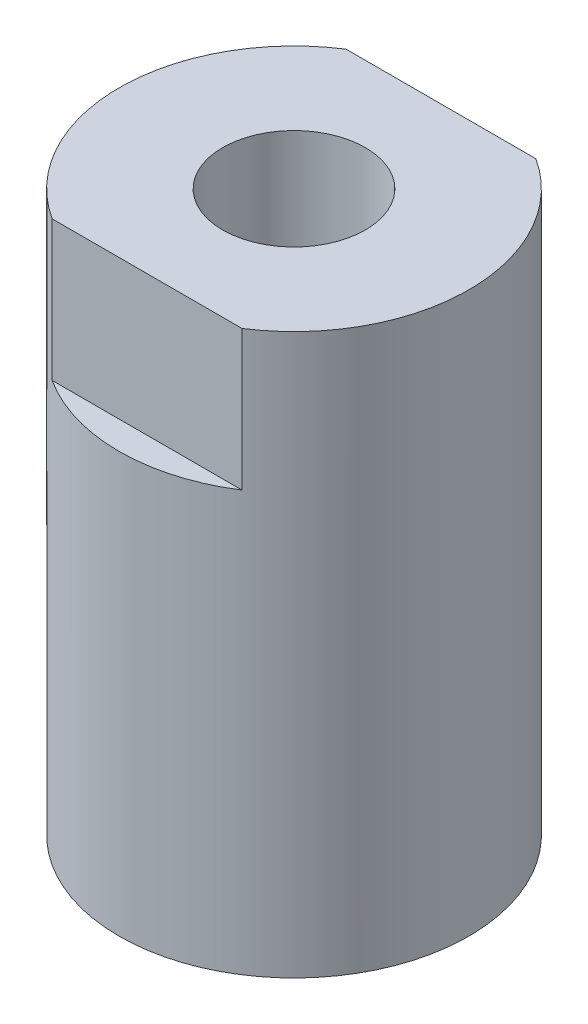
ISO-10303-21;
HEADER;
FILE_DESCRIPTION(('STEP AP214'),'2;1');
FILE_NAME('part.step','',(''),(''),'','','');
FILE_SCHEMA(('AUTOMOTIVE_DESIGN { 1 0 10303 214 1 1 1 1 }'));
ENDSEC;
DATA;
#1=APPLICATION_CONTEXT('core data for automotive mechanical design processes');
#2=APPLICATION_PROTOCOL_DEFINITION('international standard','automotive_design',2000,#1);
#3=PRODUCT_CONTEXT('',#1,'mechanical');
#4=PRODUCT('Part','Part','',(#3));
#5=PRODUCT_RELATED_PRODUCT_CATEGORY('part','',(#4));
#6=PRODUCT_DEFINITION_FORMATION('','',#4);
#7=PRODUCT_DEFINITION_CONTEXT('part definition',#1,'design');
#8=PRODUCT_DEFINITION('design','',#6,#7);
#9=PRODUCT_DEFINITION_SHAPE('','',#8);
#10=(LENGTH_UNIT() NAMED_UNIT(*) SI_UNIT(.MILLI.,.METRE.));
#11=(NAMED_UNIT(*) PLANE_ANGLE_UNIT() SI_UNIT($,.RADIAN.));
#12=(NAMED_UNIT(*) SI_UNIT($,.STERADIAN.) SOLID_ANGLE_UNIT());
#13=UNCERTAINTY_MEASURE_WITH_UNIT(LENGTH_MEASURE(1.E-05),#10,'distance_accuracy_value','');
#14=(GEOMETRIC_REPRESENTATION_CONTEXT(3) GLOBAL_UNCERTAINTY_ASSIGNED_CONTEXT((#13)) GLOBAL_UNIT_ASSIGNED_CONTEXT((#10,
#11,#12)) REPRESENTATION_CONTEXT('',''));
#15=CARTESIAN_POINT('',(0.,0.,0.));
#16=DIRECTION('',(0.,0.,1.));
#17=DIRECTION('',(1.,0.,0.));
#18=AXIS2_PLACEMENT_3D('',#15,#16,#17);
#19=CARTESIAN_POINT('',(0.,40.,0.));
#20=DIRECTION('',(0.,-1.,0.));
#21=DIRECTION('',(0.,0.,-1.));
#22=AXIS2_PLACEMENT_3D('',#19,#20,#21);
#23=CYLINDRICAL_SURFACE('',#22,12.5);
#24=CARTESIAN_POINT('',(0.,0.,0.));
#25=DIRECTION('',(0.,1.,0.));
#26=DIRECTION('',(0.,0.,1.));
#27=AXIS2_PLACEMENT_3D('',#24,#25,#26);
#28=CIRCLE('',#27,12.5);
#29=CARTESIAN_POINT('',(0.,0.,12.5));
#30=VERTEX_POINT('',#29);
#31=EDGE_CURVE('E95',#30,#30,#28,.T.);
#32=ORIENTED_EDGE('',*,*,#31,.T.);
#33=EDGE_LOOP('',(#32));
#34=FACE_BOUND('',#33,.T.);
#35=DIRECTION('',(0.,-1.,0.));
#36=VECTOR('',#35,1.);
#37=CARTESIAN_POINT('',(6.78232998312526,40.,-10.5));
#38=LINE('',#37,#36);
#39=CARTESIAN_POINT('',(6.78232998312526,40.,-10.5));
#40=VERTEX_POINT('',#39);
#41=CARTESIAN_POINT('',(6.78232998312526,30.,-10.5));
#42=VERTEX_POINT('',#41);
#43=EDGE_CURVE('E98',#40,#42,#38,.T.);
#44=ORIENTED_EDGE('',*,*,#43,.F.);
#45=CARTESIAN_POINT('',(0.,40.,0.));
#46=DIRECTION('',(0.,1.,0.));
#47=DIRECTION('',(0.,0.,1.));
#48=AXIS2_PLACEMENT_3D('',#45,#46,#47);
#49=CIRCLE('',#48,12.5);
#50=CARTESIAN_POINT('',(6.78232998312528,40.,10.5));
#51=VERTEX_POINT('',#50);
#52=EDGE_CURVE('E86',#51,#40,#49,.T.);
#53=ORIENTED_EDGE('',*,*,#52,.F.);
#54=DIRECTION('',(0.,-1.,0.));
#55=VECTOR('',#54,1.);
#56=CARTESIAN_POINT('',(6.78232998312528,40.,10.5));
#57=LINE('',#56,#55);
#58=CARTESIAN_POINT('',(6.78232998312528,30.,10.5));
#59=VERTEX_POINT('',#58);
#60=EDGE_CURVE('E59',#59,#51,#57,.F.);
#61=ORIENTED_EDGE('',*,*,#60,.F.);
#62=CARTESIAN_POINT('',(0.,30.,0.));
#63=DIRECTION('',(0.,-1.,0.));
#64=DIRECTION('',(0.,0.,-1.));
#65=AXIS2_PLACEMENT_3D('',#62,#63,#64);
#66=CIRCLE('',#65,12.5);
#67=CARTESIAN_POINT('',(-6.78232998312528,30.,10.5));
#68=VERTEX_POINT('',#67);
#69=EDGE_CURVE('E40',#59,#68,#66,.T.);
#70=ORIENTED_EDGE('',*,*,#69,.T.);
#71=DIRECTION('',(0.,-1.,0.));
#72=VECTOR('',#71,1.);
#73=CARTESIAN_POINT('',(-6.78232998312528,40.,10.5));
#74=LINE('',#73,#72);
#75=CARTESIAN_POINT('',(-6.78232998312528,40.,10.5));
#76=VERTEX_POINT('',#75);
#77=EDGE_CURVE('E79',#76,#68,#74,.T.);
#78=ORIENTED_EDGE('',*,*,#77,.F.);
#79=CARTESIAN_POINT('',(-6.78232998312526,40.,-10.5));
#80=VERTEX_POINT('',#79);
#81=EDGE_CURVE('E92',#80,#76,#49,.T.);
#82=ORIENTED_EDGE('',*,*,#81,.F.);
#83=DIRECTION('',(0.,-1.,0.));
#84=VECTOR('',#83,1.);
#85=CARTESIAN_POINT('',(-6.78232998312526,40.,-10.5));
#86=LINE('',#85,#84);
#87=CARTESIAN_POINT('',(-6.78232998312526,30.,-10.5));
#88=VERTEX_POINT('',#87);
#89=EDGE_CURVE('E51',#88,#80,#86,.F.);
#90=ORIENTED_EDGE('',*,*,#89,.F.);
#91=EDGE_CURVE('E11',#88,#42,#66,.T.);
#92=ORIENTED_EDGE('',*,*,#91,.T.);
#93=EDGE_LOOP('',(#44,#53,#61,#70,#78,#82,#90,#92));
#94=FACE_BOUND('',#93,.T.);
#95=ADVANCED_FACE('F37',(#34,#94),#23,.T.);
#96=CARTESIAN_POINT('',(0.,40.,0.));
#97=DIRECTION('',(0.,1.,0.));
#98=DIRECTION('',(0.,0.,1.));
#99=AXIS2_PLACEMENT_3D('',#96,#97,#98);
#100=PLANE('',#99);
#101=CARTESIAN_POINT('',(0.,40.,0.));
#102=DIRECTION('',(0.,1.,0.));
#103=DIRECTION('',(0.,0.,1.));
#104=AXIS2_PLACEMENT_3D('',#101,#102,#103);
#105=CIRCLE('',#104,5.1);
#106=CARTESIAN_POINT('',(0.,40.,5.1));
#107=VERTEX_POINT('',#106);
#108=EDGE_CURVE('E111',#107,#107,#105,.T.);
#109=ORIENTED_EDGE('',*,*,#108,.F.);
#110=EDGE_LOOP('',(#109));
#111=FACE_BOUND('',#110,.T.);
#112=ORIENTED_EDGE('',*,*,#52,.T.);
#113=DIRECTION('',(-1.,0.,0.));
#114=VECTOR('',#113,1.);
#115=CARTESIAN_POINT('',(0.,40.,-10.5));
#116=LINE('',#115,#114);
#117=EDGE_CURVE('E85',#40,#80,#116,.T.);
#118=ORIENTED_EDGE('',*,*,#117,.T.);
#119=ORIENTED_EDGE('',*,*,#81,.T.);
#120=DIRECTION('',(1.,0.,0.));
#121=VECTOR('',#120,1.);
#122=CARTESIAN_POINT('',(0.,40.,10.5));
#123=LINE('',#122,#121);
#124=EDGE_CURVE('E76',#76,#51,#123,.T.);
#125=ORIENTED_EDGE('',*,*,#124,.T.);
#126=EDGE_LOOP('',(#112,#118,#119,#125));
#127=FACE_BOUND('',#126,.T.);
#128=ADVANCED_FACE('F94',(#111,#127),#100,.T.);
#129=CARTESIAN_POINT('',(0.,0.,0.));
#130=DIRECTION('',(0.,1.,0.));
#131=DIRECTION('',(0.,0.,1.));
#132=AXIS2_PLACEMENT_3D('',#129,#130,#131);
#133=PLANE('',#132);
#134=CARTESIAN_POINT('',(0.,0.,0.));
#135=DIRECTION('',(0.,1.,0.));
#136=DIRECTION('',(0.,0.,1.));
#137=AXIS2_PLACEMENT_3D('',#134,#135,#136);
#138=CIRCLE('',#137,5.09999999999999);
#139=CARTESIAN_POINT('',(0.,0.,5.09999999999999));
#140=VERTEX_POINT('',#139);
#141=EDGE_CURVE('E108',#140,#140,#138,.T.);
#142=ORIENTED_EDGE('',*,*,#141,.T.);
#143=EDGE_LOOP('',(#142));
#144=FACE_BOUND('',#143,.T.);
#145=ORIENTED_EDGE('',*,*,#31,.F.);
#146=EDGE_LOOP('',(#145));
#147=FACE_BOUND('',#146,.T.);
#148=ADVANCED_FACE('F118',(#144,#147),#133,.F.);
#149=CARTESIAN_POINT('',(15.,30.,10.5));
#150=DIRECTION('',(0.,0.,1.));
#151=DIRECTION('',(1.,0.,0.));
#152=AXIS2_PLACEMENT_3D('',#149,#150,#151);
#153=PLANE('',#152);
#154=ORIENTED_EDGE('',*,*,#77,.T.);
#155=DIRECTION('',(1.,0.,0.));
#156=VECTOR('',#155,1.);
#157=CARTESIAN_POINT('',(15.,30.,10.5));
#158=LINE('',#157,#156);
#159=EDGE_CURVE('E106',#68,#59,#158,.T.);
#160=ORIENTED_EDGE('',*,*,#159,.T.);
#161=ORIENTED_EDGE('',*,*,#60,.T.);
#162=ORIENTED_EDGE('',*,*,#124,.F.);
#163=EDGE_LOOP('',(#154,#160,#161,#162));
#164=FACE_BOUND('',#163,.T.);
#165=ADVANCED_FACE('F78',(#164),#153,.T.);
#166=CARTESIAN_POINT('',(0.,30.,0.));
#167=DIRECTION('',(0.,-1.,0.));
#168=DIRECTION('',(0.,0.,-1.));
#169=AXIS2_PLACEMENT_3D('',#166,#167,#168);
#170=PLANE('',#169);
#171=ORIENTED_EDGE('',*,*,#159,.F.);
#172=ORIENTED_EDGE('',*,*,#69,.F.);
#173=EDGE_LOOP('',(#171,#172));
#174=FACE_BOUND('',#173,.T.);
#175=ADVANCED_FACE('F128',(#174),#170,.F.);
#176=DIRECTION('',(-1.,0.,0.));
#177=VECTOR('',#176,1.);
#178=CARTESIAN_POINT('',(15.,30.,-10.5));
#179=LINE('',#178,#177);
#180=EDGE_CURVE('E104',#42,#88,#179,.T.);
#181=ORIENTED_EDGE('',*,*,#180,.F.);
#182=ORIENTED_EDGE('',*,*,#91,.F.);
#183=EDGE_LOOP('',(#181,#182));
#184=FACE_BOUND('',#183,.T.);
#185=ADVANCED_FACE('F131',(#184),#170,.F.);
#186=CARTESIAN_POINT('',(15.,30.,-10.5));
#187=DIRECTION('',(0.,0.,-1.));
#188=DIRECTION('',(-1.,0.,0.));
#189=AXIS2_PLACEMENT_3D('',#186,#187,#188);
#190=PLANE('',#189);
#191=ORIENTED_EDGE('',*,*,#43,.T.);
#192=ORIENTED_EDGE('',*,*,#180,.T.);
#193=ORIENTED_EDGE('',*,*,#89,.T.);
#194=ORIENTED_EDGE('',*,*,#117,.F.);
#195=EDGE_LOOP('',(#191,#192,#193,#194));
#196=FACE_BOUND('',#195,.T.);
#197=ADVANCED_FACE('F135',(#196),#190,.T.);
#198=CARTESIAN_POINT('',(0.,40.,0.));
#199=DIRECTION('',(0.,1.,0.));
#200=DIRECTION('',(0.,0.,1.));
#201=AXIS2_PLACEMENT_3D('',#198,#199,#200);
#202=CYLINDRICAL_SURFACE('',#201,5.1);
#203=ORIENTED_EDGE('',*,*,#141,.F.);
#204=EDGE_LOOP('',(#203));
#205=FACE_BOUND('',#204,.T.);
#206=ORIENTED_EDGE('',*,*,#108,.T.);
#207=EDGE_LOOP('',(#206));
#208=FACE_BOUND('',#207,.T.);
#209=ADVANCED_FACE('F115',(#205,#208),#202,.F.);
#210=CLOSED_SHELL('',(#95,#128,#148,#165,#175,#185,#197,#209));
#211=MANIFOLD_SOLID_BREP('B2',#210);
#212=ADVANCED_BREP_SHAPE_REPRESENTATION('',(#18,#211),#14);
#213=SHAPE_DEFINITION_REPRESENTATION(#9,#212);
ENDSEC;
END-ISO-10303-21;
